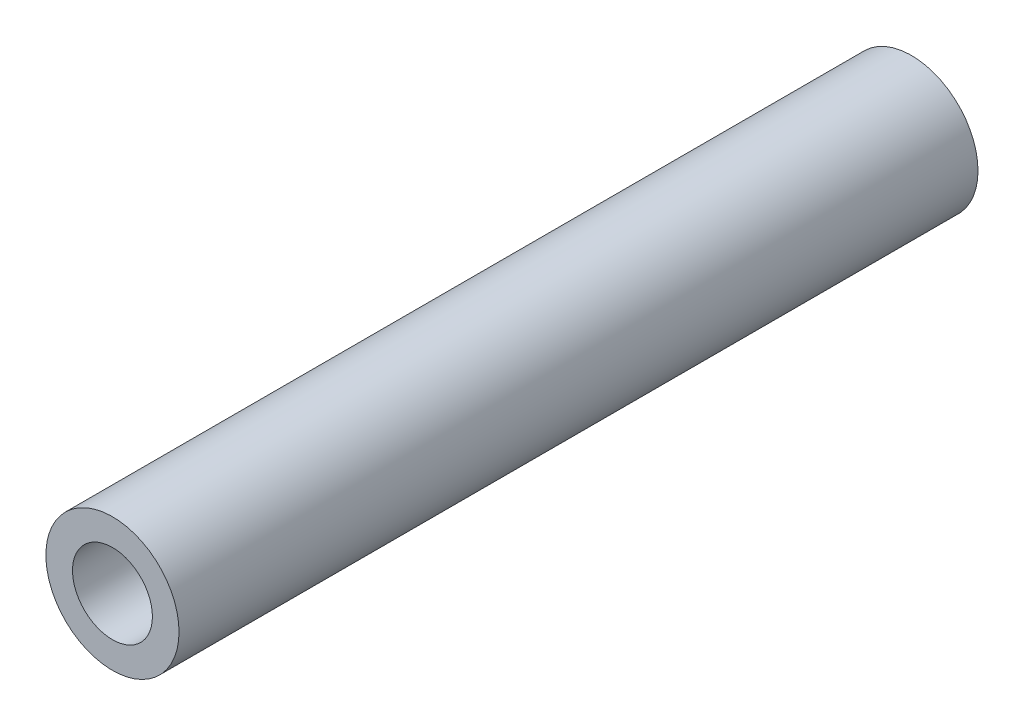
ISO-10303-21;
HEADER;
FILE_DESCRIPTION(('STEP AP214'),'2;1');
FILE_NAME('part.step','',(''),(''),'','','');
FILE_SCHEMA(('AUTOMOTIVE_DESIGN { 1 0 10303 214 1 1 1 1 }'));
ENDSEC;
DATA;
#1=APPLICATION_CONTEXT('core data for automotive mechanical design processes');
#2=APPLICATION_PROTOCOL_DEFINITION('international standard','automotive_design',2000,#1);
#3=PRODUCT_CONTEXT('',#1,'mechanical');
#4=PRODUCT('Part','Part','',(#3));
#5=PRODUCT_RELATED_PRODUCT_CATEGORY('part','',(#4));
#6=PRODUCT_DEFINITION_FORMATION('','',#4);
#7=PRODUCT_DEFINITION_CONTEXT('part definition',#1,'design');
#8=PRODUCT_DEFINITION('design','',#6,#7);
#9=PRODUCT_DEFINITION_SHAPE('','',#8);
#10=(LENGTH_UNIT() NAMED_UNIT(*) SI_UNIT(.MILLI.,.METRE.));
#11=(NAMED_UNIT(*) PLANE_ANGLE_UNIT() SI_UNIT($,.RADIAN.));
#12=(NAMED_UNIT(*) SI_UNIT($,.STERADIAN.) SOLID_ANGLE_UNIT());
#13=UNCERTAINTY_MEASURE_WITH_UNIT(LENGTH_MEASURE(1.E-05),#10,'distance_accuracy_value','');
#14=(GEOMETRIC_REPRESENTATION_CONTEXT(3) GLOBAL_UNCERTAINTY_ASSIGNED_CONTEXT((#13)) GLOBAL_UNIT_ASSIGNED_CONTEXT((#10,
#11,#12)) REPRESENTATION_CONTEXT('',''));
#15=CARTESIAN_POINT('',(0.,0.,0.));
#16=DIRECTION('',(0.,0.,1.));
#17=DIRECTION('',(1.,0.,0.));
#18=AXIS2_PLACEMENT_3D('',#15,#16,#17);
#19=CARTESIAN_POINT('',(0.,0.,15.));
#20=DIRECTION('',(0.,0.,1.));
#21=DIRECTION('',(1.,0.,0.));
#22=AXIS2_PLACEMENT_3D('',#19,#20,#21);
#23=PLANE('',#22);
#24=CARTESIAN_POINT('',(0.,0.,15.));
#25=DIRECTION('',(0.,0.,1.));
#26=DIRECTION('',(1.,0.,0.));
#27=AXIS2_PLACEMENT_3D('',#24,#25,#26);
#28=CIRCLE('',#27,2.5);
#29=CARTESIAN_POINT('',(2.5,0.,15.));
#30=VERTEX_POINT('',#29);
#31=EDGE_CURVE('E10',#30,#30,#28,.T.);
#32=ORIENTED_EDGE('',*,*,#31,.T.);
#33=EDGE_LOOP('',(#32));
#34=FACE_BOUND('',#33,.T.);
#35=CARTESIAN_POINT('',(0.,0.,15.));
#36=DIRECTION('',(0.,0.,1.));
#37=DIRECTION('',(1.,0.,0.));
#38=AXIS2_PLACEMENT_3D('',#35,#36,#37);
#39=CIRCLE('',#38,1.5);
#40=CARTESIAN_POINT('',(1.5,0.,15.));
#41=VERTEX_POINT('',#40);
#42=EDGE_CURVE('E42',#41,#41,#39,.T.);
#43=ORIENTED_EDGE('',*,*,#42,.F.);
#44=EDGE_LOOP('',(#43));
#45=FACE_BOUND('',#44,.T.);
#46=ADVANCED_FACE('F31',(#34,#45),#23,.T.);
#47=CARTESIAN_POINT('',(0.,0.,-15.));
#48=DIRECTION('',(0.,0.,1.));
#49=DIRECTION('',(1.,0.,0.));
#50=AXIS2_PLACEMENT_3D('',#47,#48,#49);
#51=PLANE('',#50);
#52=CARTESIAN_POINT('',(0.,0.,-15.));
#53=DIRECTION('',(0.,0.,1.));
#54=DIRECTION('',(1.,0.,0.));
#55=AXIS2_PLACEMENT_3D('',#52,#53,#54);
#56=CIRCLE('',#55,2.5);
#57=CARTESIAN_POINT('',(2.5,0.,-15.));
#58=VERTEX_POINT('',#57);
#59=EDGE_CURVE('E35',#58,#58,#56,.T.);
#60=ORIENTED_EDGE('',*,*,#59,.F.);
#61=EDGE_LOOP('',(#60));
#62=FACE_BOUND('',#61,.T.);
#63=CARTESIAN_POINT('',(0.,0.,-15.));
#64=DIRECTION('',(0.,0.,1.));
#65=DIRECTION('',(1.,0.,0.));
#66=AXIS2_PLACEMENT_3D('',#63,#64,#65);
#67=CIRCLE('',#66,1.5);
#68=CARTESIAN_POINT('',(1.5,0.,-15.));
#69=VERTEX_POINT('',#68);
#70=EDGE_CURVE('E44',#69,#69,#67,.T.);
#71=ORIENTED_EDGE('',*,*,#70,.T.);
#72=EDGE_LOOP('',(#71));
#73=FACE_BOUND('',#72,.T.);
#74=ADVANCED_FACE('F54',(#62,#73),#51,.F.);
#75=CARTESIAN_POINT('',(0.,0.,15.));
#76=DIRECTION('',(0.,0.,-1.));
#77=DIRECTION('',(-1.,0.,0.));
#78=AXIS2_PLACEMENT_3D('',#75,#76,#77);
#79=CYLINDRICAL_SURFACE('',#78,2.5);
#80=ORIENTED_EDGE('',*,*,#31,.F.);
#81=EDGE_LOOP('',(#80));
#82=FACE_BOUND('',#81,.T.);
#83=ORIENTED_EDGE('',*,*,#59,.T.);
#84=EDGE_LOOP('',(#83));
#85=FACE_BOUND('',#84,.T.);
#86=ADVANCED_FACE('F33',(#82,#85),#79,.T.);
#87=CARTESIAN_POINT('',(0.,0.,15.));
#88=DIRECTION('',(0.,0.,-1.));
#89=DIRECTION('',(-1.,0.,0.));
#90=AXIS2_PLACEMENT_3D('',#87,#88,#89);
#91=CYLINDRICAL_SURFACE('',#90,1.5);
#92=ORIENTED_EDGE('',*,*,#42,.T.);
#93=EDGE_LOOP('',(#92));
#94=FACE_BOUND('',#93,.T.);
#95=ORIENTED_EDGE('',*,*,#70,.F.);
#96=EDGE_LOOP('',(#95));
#97=FACE_BOUND('',#96,.T.);
#98=ADVANCED_FACE('F50',(#94,#97),#91,.F.);
#99=CLOSED_SHELL('',(#46,#74,#86,#98));
#100=MANIFOLD_SOLID_BREP('B2',#99);
#101=ADVANCED_BREP_SHAPE_REPRESENTATION('',(#18,#100),#14);
#102=SHAPE_DEFINITION_REPRESENTATION(#9,#101);
ENDSEC;
END-ISO-10303-21;
